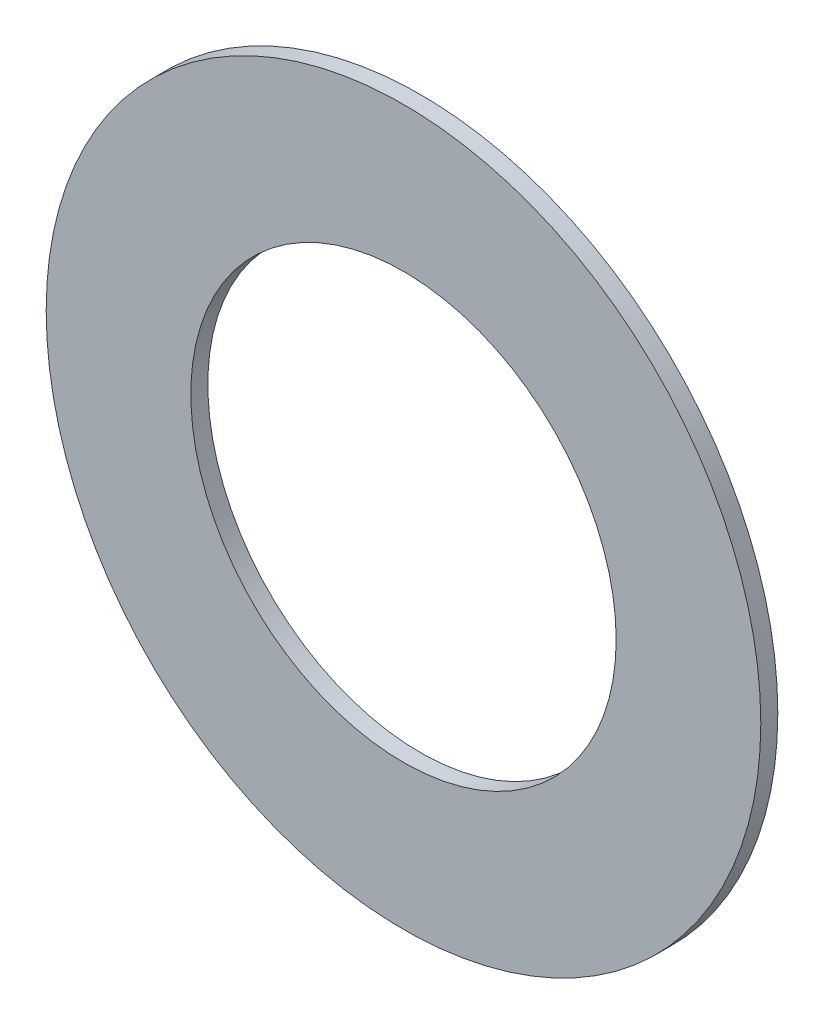
ISO-10303-21;
HEADER;
FILE_DESCRIPTION(('STEP AP214'),'2;1');
FILE_NAME('part.step','',(''),(''),'','','');
FILE_SCHEMA(('AUTOMOTIVE_DESIGN { 1 0 10303 214 1 1 1 1 }'));
ENDSEC;
DATA;
#1=APPLICATION_CONTEXT('core data for automotive mechanical design processes');
#2=APPLICATION_PROTOCOL_DEFINITION('international standard','automotive_design',2000,#1);
#3=PRODUCT_CONTEXT('',#1,'mechanical');
#4=PRODUCT('Part','Part','',(#3));
#5=PRODUCT_RELATED_PRODUCT_CATEGORY('part','',(#4));
#6=PRODUCT_DEFINITION_FORMATION('','',#4);
#7=PRODUCT_DEFINITION_CONTEXT('part definition',#1,'design');
#8=PRODUCT_DEFINITION('design','',#6,#7);
#9=PRODUCT_DEFINITION_SHAPE('','',#8);
#10=(LENGTH_UNIT() NAMED_UNIT(*) SI_UNIT(.MILLI.,.METRE.));
#11=(NAMED_UNIT(*) PLANE_ANGLE_UNIT() SI_UNIT($,.RADIAN.));
#12=(NAMED_UNIT(*) SI_UNIT($,.STERADIAN.) SOLID_ANGLE_UNIT());
#13=UNCERTAINTY_MEASURE_WITH_UNIT(LENGTH_MEASURE(1.E-05),#10,'distance_accuracy_value','');
#14=(GEOMETRIC_REPRESENTATION_CONTEXT(3) GLOBAL_UNCERTAINTY_ASSIGNED_CONTEXT((#13)) GLOBAL_UNIT_ASSIGNED_CONTEXT((#10,
#11,#12)) REPRESENTATION_CONTEXT('',''));
#15=CARTESIAN_POINT('',(0.,0.,0.));
#16=DIRECTION('',(0.,0.,1.));
#17=DIRECTION('',(1.,0.,0.));
#18=AXIS2_PLACEMENT_3D('',#15,#16,#17);
#19=CARTESIAN_POINT('',(0.,0.,1.));
#20=DIRECTION('',(0.,0.,1.));
#21=DIRECTION('',(1.,0.,0.));
#22=AXIS2_PLACEMENT_3D('',#19,#20,#21);
#23=PLANE('',#22);
#24=CARTESIAN_POINT('',(0.,0.,1.));
#25=DIRECTION('',(0.,0.,1.));
#26=DIRECTION('',(1.,0.,0.));
#27=AXIS2_PLACEMENT_3D('',#24,#25,#26);
#28=CIRCLE('',#27,21.);
#29=CARTESIAN_POINT('',(21.,0.,1.));
#30=VERTEX_POINT('',#29);
#31=EDGE_CURVE('E10',#30,#30,#28,.T.);
#32=ORIENTED_EDGE('',*,*,#31,.T.);
#33=EDGE_LOOP('',(#32));
#34=FACE_BOUND('',#33,.T.);
#35=CARTESIAN_POINT('',(0.,0.,1.));
#36=DIRECTION('',(0.,0.,1.));
#37=DIRECTION('',(1.,0.,0.));
#38=AXIS2_PLACEMENT_3D('',#35,#36,#37);
#39=CIRCLE('',#38,12.5);
#40=CARTESIAN_POINT('',(12.5,0.,1.));
#41=VERTEX_POINT('',#40);
#42=EDGE_CURVE('E49',#41,#41,#39,.T.);
#43=ORIENTED_EDGE('',*,*,#42,.F.);
#44=EDGE_LOOP('',(#43));
#45=FACE_BOUND('',#44,.T.);
#46=ADVANCED_FACE('F39',(#34,#45),#23,.T.);
#47=CARTESIAN_POINT('',(0.,0.,0.));
#48=DIRECTION('',(0.,0.,1.));
#49=DIRECTION('',(1.,0.,0.));
#50=AXIS2_PLACEMENT_3D('',#47,#48,#49);
#51=PLANE('',#50);
#52=CARTESIAN_POINT('',(0.,0.,0.));
#53=DIRECTION('',(0.,0.,1.));
#54=DIRECTION('',(1.,0.,0.));
#55=AXIS2_PLACEMENT_3D('',#52,#53,#54);
#56=CIRCLE('',#55,21.);
#57=CARTESIAN_POINT('',(21.,0.,0.));
#58=VERTEX_POINT('',#57);
#59=EDGE_CURVE('E43',#58,#58,#56,.T.);
#60=ORIENTED_EDGE('',*,*,#59,.F.);
#61=EDGE_LOOP('',(#60));
#62=FACE_BOUND('',#61,.T.);
#63=CARTESIAN_POINT('',(0.,0.,0.));
#64=DIRECTION('',(0.,0.,1.));
#65=DIRECTION('',(1.,0.,0.));
#66=AXIS2_PLACEMENT_3D('',#63,#64,#65);
#67=CIRCLE('',#66,12.5);
#68=CARTESIAN_POINT('',(12.5,0.,0.));
#69=VERTEX_POINT('',#68);
#70=EDGE_CURVE('E55',#69,#69,#67,.T.);
#71=ORIENTED_EDGE('',*,*,#70,.T.);
#72=EDGE_LOOP('',(#71));
#73=FACE_BOUND('',#72,.T.);
#74=ADVANCED_FACE('F65',(#62,#73),#51,.F.);
#75=CARTESIAN_POINT('',(0.,0.,1.));
#76=DIRECTION('',(0.,0.,-1.));
#77=DIRECTION('',(-1.,0.,0.));
#78=AXIS2_PLACEMENT_3D('',#75,#76,#77);
#79=CYLINDRICAL_SURFACE('',#78,21.);
#80=ORIENTED_EDGE('',*,*,#31,.F.);
#81=EDGE_LOOP('',(#80));
#82=FACE_BOUND('',#81,.T.);
#83=ORIENTED_EDGE('',*,*,#59,.T.);
#84=EDGE_LOOP('',(#83));
#85=FACE_BOUND('',#84,.T.);
#86=ADVANCED_FACE('F41',(#82,#85),#79,.T.);
#87=CARTESIAN_POINT('',(0.,0.,1.));
#88=DIRECTION('',(0.,0.,-1.));
#89=DIRECTION('',(-1.,0.,0.));
#90=AXIS2_PLACEMENT_3D('',#87,#88,#89);
#91=CYLINDRICAL_SURFACE('',#90,12.5);
#92=ORIENTED_EDGE('',*,*,#42,.T.);
#93=EDGE_LOOP('',(#92));
#94=FACE_BOUND('',#93,.T.);
#95=ORIENTED_EDGE('',*,*,#70,.F.);
#96=EDGE_LOOP('',(#95));
#97=FACE_BOUND('',#96,.T.);
#98=ADVANCED_FACE('F59',(#94,#97),#91,.F.);
#99=CLOSED_SHELL('',(#46,#74,#86,#98));
#100=MANIFOLD_SOLID_BREP('B2',#99);
#101=ADVANCED_BREP_SHAPE_REPRESENTATION('',(#18,#100),#14);
#102=SHAPE_DEFINITION_REPRESENTATION(#9,#101);
ENDSEC;
END-ISO-10303-21;
